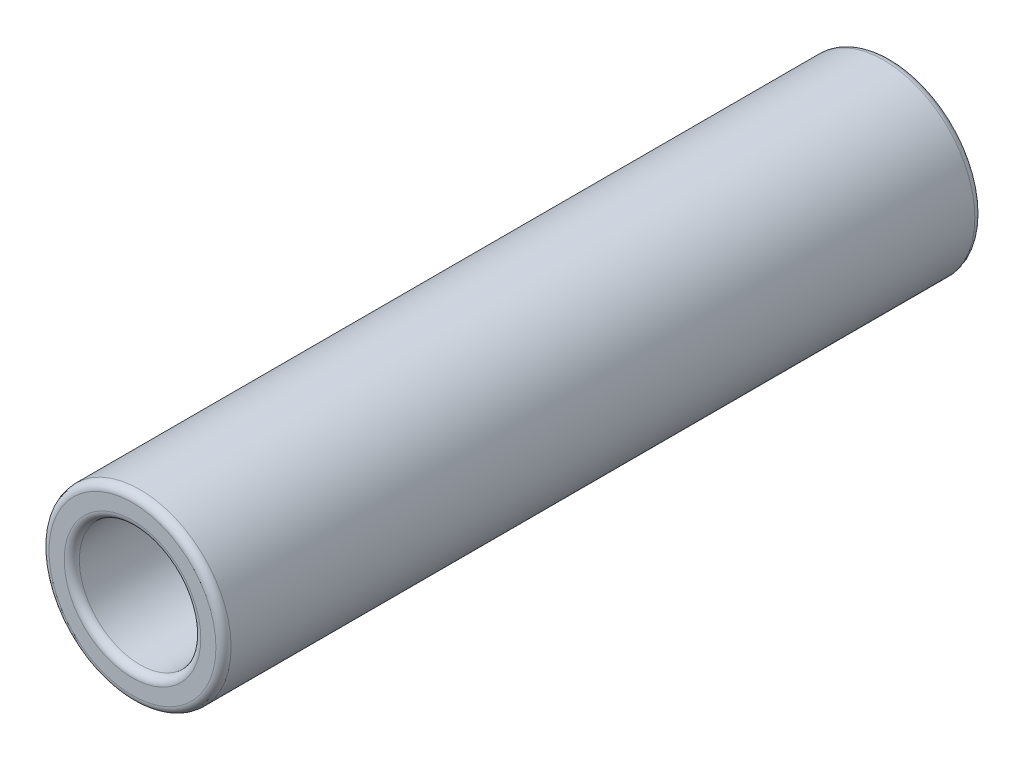
ISO-10303-21;
HEADER;
FILE_DESCRIPTION(('STEP AP214'),'2;1');
FILE_NAME('part.step','',(''),(''),'','','');
FILE_SCHEMA(('AUTOMOTIVE_DESIGN { 1 0 10303 214 1 1 1 1 }'));
ENDSEC;
DATA;
#1=APPLICATION_CONTEXT('core data for automotive mechanical design processes');
#2=APPLICATION_PROTOCOL_DEFINITION('international standard','automotive_design',2000,#1);
#3=PRODUCT_CONTEXT('',#1,'mechanical');
#4=PRODUCT('Part','Part','',(#3));
#5=PRODUCT_RELATED_PRODUCT_CATEGORY('part','',(#4));
#6=PRODUCT_DEFINITION_FORMATION('','',#4);
#7=PRODUCT_DEFINITION_CONTEXT('part definition',#1,'design');
#8=PRODUCT_DEFINITION('design','',#6,#7);
#9=PRODUCT_DEFINITION_SHAPE('','',#8);
#10=(LENGTH_UNIT() NAMED_UNIT(*) SI_UNIT(.MILLI.,.METRE.));
#11=(NAMED_UNIT(*) PLANE_ANGLE_UNIT() SI_UNIT($,.RADIAN.));
#12=(NAMED_UNIT(*) SI_UNIT($,.STERADIAN.) SOLID_ANGLE_UNIT());
#13=UNCERTAINTY_MEASURE_WITH_UNIT(LENGTH_MEASURE(1.E-05),#10,'distance_accuracy_value','');
#14=(GEOMETRIC_REPRESENTATION_CONTEXT(3) GLOBAL_UNCERTAINTY_ASSIGNED_CONTEXT((#13)) GLOBAL_UNIT_ASSIGNED_CONTEXT((#10,
#11,#12)) REPRESENTATION_CONTEXT('',''));
#15=CARTESIAN_POINT('',(0.,0.,0.));
#16=DIRECTION('',(0.,0.,1.));
#17=DIRECTION('',(1.,0.,0.));
#18=AXIS2_PLACEMENT_3D('',#15,#16,#17);
#19=CARTESIAN_POINT('',(0.,0.,25.));
#20=DIRECTION('',(0.,0.,1.));
#21=DIRECTION('',(1.,0.,0.));
#22=AXIS2_PLACEMENT_3D('',#19,#20,#21);
#23=PLANE('',#22);
#24=CARTESIAN_POINT('',(0.,0.,25.));
#25=DIRECTION('',(0.,0.,1.));
#26=DIRECTION('',(1.,0.,0.));
#27=AXIS2_PLACEMENT_3D('',#24,#25,#26);
#28=CIRCLE('',#27,4.5);
#29=CARTESIAN_POINT('',(4.5,0.,25.));
#30=VERTEX_POINT('',#29);
#31=EDGE_CURVE('E52',#30,#30,#28,.F.);
#32=ORIENTED_EDGE('',*,*,#31,.T.);
#33=EDGE_LOOP('',(#32));
#34=FACE_BOUND('',#33,.T.);
#35=CARTESIAN_POINT('',(0.,0.,25.));
#36=DIRECTION('',(0.,0.,1.));
#37=DIRECTION('',(1.,0.,0.));
#38=AXIS2_PLACEMENT_3D('',#35,#36,#37);
#39=CIRCLE('',#38,5.5);
#40=CARTESIAN_POINT('',(5.5,0.,25.));
#41=VERTEX_POINT('',#40);
#42=EDGE_CURVE('E57',#41,#41,#39,.T.);
#43=ORIENTED_EDGE('',*,*,#42,.T.);
#44=EDGE_LOOP('',(#43));
#45=FACE_BOUND('',#44,.T.);
#46=ADVANCED_FACE('F39',(#34,#45),#23,.T.);
#47=CARTESIAN_POINT('',(0.,0.,-25.));
#48=DIRECTION('',(0.,0.,1.));
#49=DIRECTION('',(1.,0.,0.));
#50=AXIS2_PLACEMENT_3D('',#47,#48,#49);
#51=PLANE('',#50);
#52=CARTESIAN_POINT('',(0.,0.,-25.));
#53=DIRECTION('',(0.,0.,1.));
#54=DIRECTION('',(1.,0.,0.));
#55=AXIS2_PLACEMENT_3D('',#52,#53,#54);
#56=CIRCLE('',#55,4.5);
#57=CARTESIAN_POINT('',(4.5,0.,-25.));
#58=VERTEX_POINT('',#57);
#59=EDGE_CURVE('E71',#58,#58,#56,.T.);
#60=ORIENTED_EDGE('',*,*,#59,.T.);
#61=EDGE_LOOP('',(#60));
#62=FACE_BOUND('',#61,.T.);
#63=CARTESIAN_POINT('',(0.,0.,-25.));
#64=DIRECTION('',(0.,0.,1.));
#65=DIRECTION('',(1.,0.,0.));
#66=AXIS2_PLACEMENT_3D('',#63,#64,#65);
#67=CIRCLE('',#66,5.5);
#68=CARTESIAN_POINT('',(5.5,0.,-25.));
#69=VERTEX_POINT('',#68);
#70=EDGE_CURVE('E75',#69,#69,#67,.F.);
#71=ORIENTED_EDGE('',*,*,#70,.T.);
#72=EDGE_LOOP('',(#71));
#73=FACE_BOUND('',#72,.T.);
#74=ADVANCED_FACE('F80',(#62,#73),#51,.F.);
#75=CARTESIAN_POINT('',(0.,0.,25.));
#76=DIRECTION('',(0.,0.,-1.));
#77=DIRECTION('',(-1.,0.,0.));
#78=AXIS2_PLACEMENT_3D('',#75,#76,#77);
#79=CYLINDRICAL_SURFACE('',#78,6.);
#80=CARTESIAN_POINT('',(0.,0.,-24.5));
#81=DIRECTION('',(0.,0.,1.));
#82=DIRECTION('',(1.,0.,0.));
#83=AXIS2_PLACEMENT_3D('',#80,#81,#82);
#84=CIRCLE('',#83,6.);
#85=CARTESIAN_POINT('',(6.,0.,-24.5));
#86=VERTEX_POINT('',#85);
#87=EDGE_CURVE('E10',#86,#86,#84,.T.);
#88=ORIENTED_EDGE('',*,*,#87,.T.);
#89=EDGE_LOOP('',(#88));
#90=FACE_BOUND('',#89,.T.);
#91=CARTESIAN_POINT('',(0.,0.,24.5));
#92=DIRECTION('',(0.,0.,1.));
#93=DIRECTION('',(1.,0.,0.));
#94=AXIS2_PLACEMENT_3D('',#91,#92,#93);
#95=CIRCLE('',#94,6.);
#96=CARTESIAN_POINT('',(6.,0.,24.5));
#97=VERTEX_POINT('',#96);
#98=EDGE_CURVE('E47',#97,#97,#95,.F.);
#99=ORIENTED_EDGE('',*,*,#98,.T.);
#100=EDGE_LOOP('',(#99));
#101=FACE_BOUND('',#100,.T.);
#102=ADVANCED_FACE('F100',(#90,#101),#79,.T.);
#103=CARTESIAN_POINT('',(0.,0.,25.));
#104=DIRECTION('',(0.,0.,-1.));
#105=DIRECTION('',(-1.,0.,0.));
#106=AXIS2_PLACEMENT_3D('',#103,#104,#105);
#107=CYLINDRICAL_SURFACE('',#106,4.);
#108=CARTESIAN_POINT('',(0.,0.,-24.5));
#109=DIRECTION('',(0.,0.,1.));
#110=DIRECTION('',(1.,0.,0.));
#111=AXIS2_PLACEMENT_3D('',#108,#109,#110);
#112=CIRCLE('',#111,4.);
#113=CARTESIAN_POINT('',(4.,0.,-24.5));
#114=VERTEX_POINT('',#113);
#115=EDGE_CURVE('E63',#114,#114,#112,.F.);
#116=ORIENTED_EDGE('',*,*,#115,.T.);
#117=EDGE_LOOP('',(#116));
#118=FACE_BOUND('',#117,.T.);
#119=CARTESIAN_POINT('',(0.,0.,24.5));
#120=DIRECTION('',(0.,0.,1.));
#121=DIRECTION('',(1.,0.,0.));
#122=AXIS2_PLACEMENT_3D('',#119,#120,#121);
#123=CIRCLE('',#122,4.);
#124=CARTESIAN_POINT('',(4.,0.,24.5));
#125=VERTEX_POINT('',#124);
#126=EDGE_CURVE('E67',#125,#125,#123,.T.);
#127=ORIENTED_EDGE('',*,*,#126,.T.);
#128=EDGE_LOOP('',(#127));
#129=FACE_BOUND('',#128,.T.);
#130=ADVANCED_FACE('F105',(#118,#129),#107,.F.);
#131=CARTESIAN_POINT('',(0.,0.,-24.5));
#132=DIRECTION('',(0.,0.,1.));
#133=DIRECTION('',(1.,0.,0.));
#134=AXIS2_PLACEMENT_3D('',#131,#132,#133);
#135=TOROIDAL_SURFACE('',#134,4.5,0.5);
#136=ORIENTED_EDGE('',*,*,#115,.F.);
#137=EDGE_LOOP('',(#136));
#138=FACE_BOUND('',#137,.T.);
#139=ORIENTED_EDGE('',*,*,#59,.F.);
#140=EDGE_LOOP('',(#139));
#141=FACE_BOUND('',#140,.T.);
#142=ADVANCED_FACE('F91',(#138,#141),#135,.T.);
#143=CARTESIAN_POINT('',(0.,0.,24.5));
#144=DIRECTION('',(0.,0.,1.));
#145=DIRECTION('',(1.,0.,0.));
#146=AXIS2_PLACEMENT_3D('',#143,#144,#145);
#147=TOROIDAL_SURFACE('',#146,4.5,0.5);
#148=ORIENTED_EDGE('',*,*,#31,.F.);
#149=EDGE_LOOP('',(#148));
#150=FACE_BOUND('',#149,.T.);
#151=ORIENTED_EDGE('',*,*,#126,.F.);
#152=EDGE_LOOP('',(#151));
#153=FACE_BOUND('',#152,.T.);
#154=ADVANCED_FACE('F85',(#150,#153),#147,.T.);
#155=CARTESIAN_POINT('',(0.,0.,-24.5));
#156=DIRECTION('',(0.,0.,1.));
#157=DIRECTION('',(1.,0.,0.));
#158=AXIS2_PLACEMENT_3D('',#155,#156,#157);
#159=TOROIDAL_SURFACE('',#158,5.5,0.5);
#160=ORIENTED_EDGE('',*,*,#70,.F.);
#161=EDGE_LOOP('',(#160));
#162=FACE_BOUND('',#161,.T.);
#163=ORIENTED_EDGE('',*,*,#87,.F.);
#164=EDGE_LOOP('',(#163));
#165=FACE_BOUND('',#164,.T.);
#166=ADVANCED_FACE('F82',(#162,#165),#159,.T.);
#167=CARTESIAN_POINT('',(0.,0.,24.5));
#168=DIRECTION('',(0.,0.,1.));
#169=DIRECTION('',(1.,0.,0.));
#170=AXIS2_PLACEMENT_3D('',#167,#168,#169);
#171=TOROIDAL_SURFACE('',#170,5.5,0.5);
#172=ORIENTED_EDGE('',*,*,#98,.F.);
#173=EDGE_LOOP('',(#172));
#174=FACE_BOUND('',#173,.T.);
#175=ORIENTED_EDGE('',*,*,#42,.F.);
#176=EDGE_LOOP('',(#175));
#177=FACE_BOUND('',#176,.T.);
#178=ADVANCED_FACE('F41',(#174,#177),#171,.T.);
#179=CLOSED_SHELL('',(#46,#74,#102,#130,#142,#154,#166,#178));
#180=MANIFOLD_SOLID_BREP('B2',#179);
#181=ADVANCED_BREP_SHAPE_REPRESENTATION('',(#18,#180),#14);
#182=SHAPE_DEFINITION_REPRESENTATION(#9,#181);
ENDSEC;
END-ISO-10303-21;
